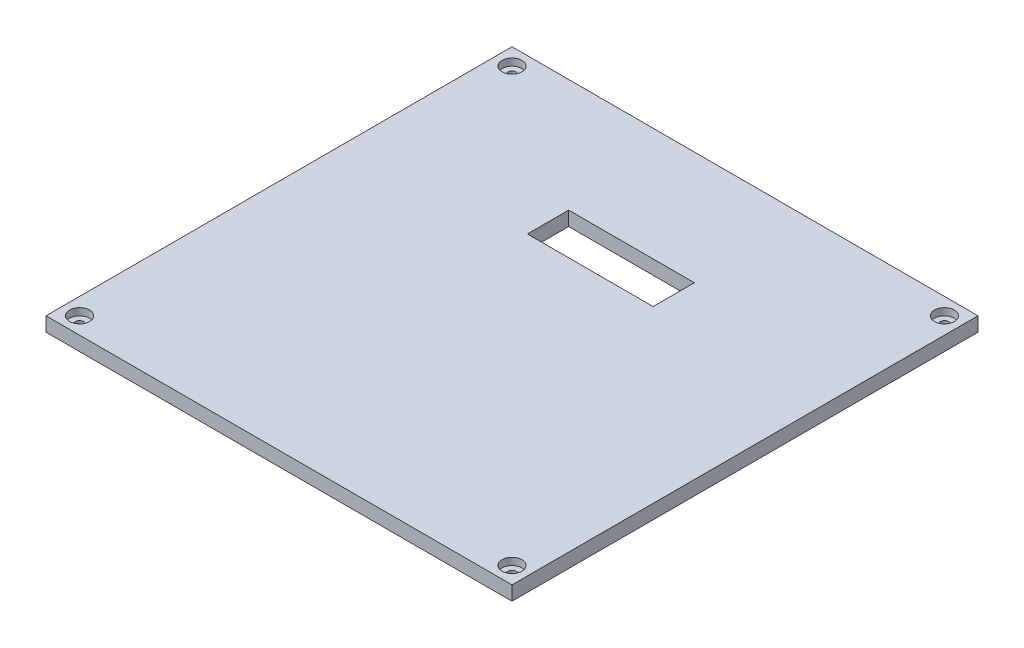
ISO-10303-21;
HEADER;
FILE_DESCRIPTION(('STEP AP214'),'2;1');
FILE_NAME('part.step','',(''),(''),'','','');
FILE_SCHEMA(('AUTOMOTIVE_DESIGN { 1 0 10303 214 1 1 1 1 }'));
ENDSEC;
DATA;
#1=APPLICATION_CONTEXT('core data for automotive mechanical design processes');
#2=APPLICATION_PROTOCOL_DEFINITION('international standard','automotive_design',2000,#1);
#3=PRODUCT_CONTEXT('',#1,'mechanical');
#4=PRODUCT('Part','Part','',(#3));
#5=PRODUCT_RELATED_PRODUCT_CATEGORY('part','',(#4));
#6=PRODUCT_DEFINITION_FORMATION('','',#4);
#7=PRODUCT_DEFINITION_CONTEXT('part definition',#1,'design');
#8=PRODUCT_DEFINITION('design','',#6,#7);
#9=PRODUCT_DEFINITION_SHAPE('','',#8);
#10=(LENGTH_UNIT() NAMED_UNIT(*) SI_UNIT(.MILLI.,.METRE.));
#11=(NAMED_UNIT(*) PLANE_ANGLE_UNIT() SI_UNIT($,.RADIAN.));
#12=(NAMED_UNIT(*) SI_UNIT($,.STERADIAN.) SOLID_ANGLE_UNIT());
#13=UNCERTAINTY_MEASURE_WITH_UNIT(LENGTH_MEASURE(1.E-05),#10,'distance_accuracy_value','');
#14=(GEOMETRIC_REPRESENTATION_CONTEXT(3) GLOBAL_UNCERTAINTY_ASSIGNED_CONTEXT((#13)) GLOBAL_UNIT_ASSIGNED_CONTEXT((#10,
#11,#12)) REPRESENTATION_CONTEXT('',''));
#15=CARTESIAN_POINT('',(0.,0.,0.));
#16=DIRECTION('',(0.,0.,1.));
#17=DIRECTION('',(1.,0.,0.));
#18=AXIS2_PLACEMENT_3D('',#15,#16,#17);
#19=CARTESIAN_POINT('',(401.094,0.,-401.094));
#20=DIRECTION('',(0.,1.,0.));
#21=DIRECTION('',(0.,0.,1.));
#22=AXIS2_PLACEMENT_3D('',#19,#20,#21);
#23=CYLINDRICAL_SURFACE('',#22,3.683);
#24=CARTESIAN_POINT('',(401.094,0.,-401.094));
#25=DIRECTION('',(0.,1.,0.));
#26=DIRECTION('',(0.,0.,-1.));
#27=AXIS2_PLACEMENT_3D('',#24,#25,#26);
#28=CIRCLE('',#27,3.683);
#29=CARTESIAN_POINT('',(401.094,0.,-404.777));
#30=VERTEX_POINT('',#29);
#31=EDGE_CURVE('E152',#30,#30,#28,.T.);
#32=ORIENTED_EDGE('',*,*,#31,.F.);
#33=EDGE_LOOP('',(#32));
#34=FACE_BOUND('',#33,.T.);
#35=CARTESIAN_POINT('',(401.094,6.35,-401.094));
#36=DIRECTION('',(0.,1.,0.));
#37=DIRECTION('',(0.,0.,1.));
#38=AXIS2_PLACEMENT_3D('',#35,#36,#37);
#39=CIRCLE('',#38,3.683);
#40=CARTESIAN_POINT('',(401.094,6.35,-397.411));
#41=VERTEX_POINT('',#40);
#42=EDGE_CURVE('E142',#41,#41,#39,.F.);
#43=ORIENTED_EDGE('',*,*,#42,.F.);
#44=EDGE_LOOP('',(#43));
#45=FACE_BOUND('',#44,.T.);
#46=ADVANCED_FACE('F39',(#34,#45),#23,.F.);
#47=CARTESIAN_POINT('',(14.986,0.,-401.094));
#48=DIRECTION('',(0.,1.,0.));
#49=DIRECTION('',(0.,0.,1.));
#50=AXIS2_PLACEMENT_3D('',#47,#48,#49);
#51=CYLINDRICAL_SURFACE('',#50,3.683);
#52=CARTESIAN_POINT('',(14.986,0.,-401.094));
#53=DIRECTION('',(0.,-1.,0.));
#54=DIRECTION('',(0.,0.,-1.));
#55=AXIS2_PLACEMENT_3D('',#52,#53,#54);
#56=CIRCLE('',#55,3.683);
#57=CARTESIAN_POINT('',(14.986,0.,-404.777));
#58=VERTEX_POINT('',#57);
#59=EDGE_CURVE('E155',#58,#58,#56,.T.);
#60=ORIENTED_EDGE('',*,*,#59,.T.);
#61=EDGE_LOOP('',(#60));
#62=FACE_BOUND('',#61,.T.);
#63=CARTESIAN_POINT('',(14.986,6.35,-401.094));
#64=DIRECTION('',(0.,1.,0.));
#65=DIRECTION('',(0.,0.,1.));
#66=AXIS2_PLACEMENT_3D('',#63,#64,#65);
#67=CIRCLE('',#66,3.683);
#68=CARTESIAN_POINT('',(14.986,6.35,-397.411));
#69=VERTEX_POINT('',#68);
#70=EDGE_CURVE('E146',#69,#69,#67,.T.);
#71=ORIENTED_EDGE('',*,*,#70,.T.);
#72=EDGE_LOOP('',(#71));
#73=FACE_BOUND('',#72,.T.);
#74=ADVANCED_FACE('F258',(#62,#73),#51,.F.);
#75=CARTESIAN_POINT('',(401.094,0.,-14.986));
#76=DIRECTION('',(0.,1.,0.));
#77=DIRECTION('',(0.,0.,1.));
#78=AXIS2_PLACEMENT_3D('',#75,#76,#77);
#79=CYLINDRICAL_SURFACE('',#78,3.683);
#80=CARTESIAN_POINT('',(401.094,0.,-14.986));
#81=DIRECTION('',(0.,-1.,0.));
#82=DIRECTION('',(0.,0.,1.));
#83=AXIS2_PLACEMENT_3D('',#80,#81,#82);
#84=CIRCLE('',#83,3.683);
#85=CARTESIAN_POINT('',(401.094,0.,-11.303));
#86=VERTEX_POINT('',#85);
#87=EDGE_CURVE('E159',#86,#86,#84,.T.);
#88=ORIENTED_EDGE('',*,*,#87,.T.);
#89=EDGE_LOOP('',(#88));
#90=FACE_BOUND('',#89,.T.);
#91=CARTESIAN_POINT('',(401.094,6.35,-14.986));
#92=DIRECTION('',(0.,1.,0.));
#93=DIRECTION('',(0.,0.,1.));
#94=AXIS2_PLACEMENT_3D('',#91,#92,#93);
#95=CIRCLE('',#94,3.683);
#96=CARTESIAN_POINT('',(401.094,6.35,-11.303));
#97=VERTEX_POINT('',#96);
#98=EDGE_CURVE('E150',#97,#97,#95,.T.);
#99=ORIENTED_EDGE('',*,*,#98,.T.);
#100=EDGE_LOOP('',(#99));
#101=FACE_BOUND('',#100,.T.);
#102=ADVANCED_FACE('F265',(#90,#101),#79,.F.);
#103=CARTESIAN_POINT('',(14.986,0.,-14.986));
#104=DIRECTION('',(0.,1.,0.));
#105=DIRECTION('',(0.,0.,1.));
#106=AXIS2_PLACEMENT_3D('',#103,#104,#105);
#107=CYLINDRICAL_SURFACE('',#106,3.683);
#108=CARTESIAN_POINT('',(14.986,0.,-14.986));
#109=DIRECTION('',(0.,1.,0.));
#110=DIRECTION('',(0.,0.,1.));
#111=AXIS2_PLACEMENT_3D('',#108,#109,#110);
#112=CIRCLE('',#111,3.683);
#113=CARTESIAN_POINT('',(14.986,0.,-11.303));
#114=VERTEX_POINT('',#113);
#115=EDGE_CURVE('E166',#114,#114,#112,.T.);
#116=ORIENTED_EDGE('',*,*,#115,.F.);
#117=EDGE_LOOP('',(#116));
#118=FACE_BOUND('',#117,.T.);
#119=CARTESIAN_POINT('',(14.986,6.35,-14.986));
#120=DIRECTION('',(0.,1.,0.));
#121=DIRECTION('',(0.,0.,1.));
#122=AXIS2_PLACEMENT_3D('',#119,#120,#121);
#123=CIRCLE('',#122,3.683);
#124=CARTESIAN_POINT('',(14.986,6.35,-11.303));
#125=VERTEX_POINT('',#124);
#126=EDGE_CURVE('E165',#125,#125,#123,.F.);
#127=ORIENTED_EDGE('',*,*,#126,.F.);
#128=EDGE_LOOP('',(#127));
#129=FACE_BOUND('',#128,.T.);
#130=ADVANCED_FACE('F275',(#118,#129),#107,.F.);
#131=CARTESIAN_POINT('',(0.,12.7,-416.08));
#132=DIRECTION('',(0.,0.,-1.));
#133=DIRECTION('',(-1.,0.,0.));
#134=AXIS2_PLACEMENT_3D('',#131,#132,#133);
#135=PLANE('',#134);
#136=DIRECTION('',(1.,0.,0.));
#137=VECTOR('',#136,1.);
#138=CARTESIAN_POINT('',(0.,0.,-416.08));
#139=LINE('',#138,#137);
#140=CARTESIAN_POINT('',(0.,0.,-416.08));
#141=VERTEX_POINT('',#140);
#142=CARTESIAN_POINT('',(416.08,0.,-416.08));
#143=VERTEX_POINT('',#142);
#144=EDGE_CURVE('E169',#141,#143,#139,.T.);
#145=ORIENTED_EDGE('',*,*,#144,.F.);
#146=DIRECTION('',(0.,-1.,0.));
#147=VECTOR('',#146,1.);
#148=CARTESIAN_POINT('',(0.,12.7,-416.08));
#149=LINE('',#148,#147);
#150=CARTESIAN_POINT('',(0.,12.7,-416.08));
#151=VERTEX_POINT('',#150);
#152=EDGE_CURVE('E11',#151,#141,#149,.T.);
#153=ORIENTED_EDGE('',*,*,#152,.F.);
#154=DIRECTION('',(1.,0.,0.));
#155=VECTOR('',#154,1.);
#156=CARTESIAN_POINT('',(0.,12.7,-416.08));
#157=LINE('',#156,#155);
#158=CARTESIAN_POINT('',(416.08,12.7,-416.08));
#159=VERTEX_POINT('',#158);
#160=EDGE_CURVE('E171',#151,#159,#157,.T.);
#161=ORIENTED_EDGE('',*,*,#160,.T.);
#162=DIRECTION('',(0.,-1.,0.));
#163=VECTOR('',#162,1.);
#164=CARTESIAN_POINT('',(416.08,12.7,-416.08));
#165=LINE('',#164,#163);
#166=EDGE_CURVE('E182',#159,#143,#165,.T.);
#167=ORIENTED_EDGE('',*,*,#166,.T.);
#168=EDGE_LOOP('',(#145,#153,#161,#167));
#169=FACE_BOUND('',#168,.T.);
#170=ADVANCED_FACE('F41',(#169),#135,.T.);
#171=CARTESIAN_POINT('',(0.,12.7,0.));
#172=DIRECTION('',(-1.,0.,0.));
#173=DIRECTION('',(0.,0.,1.));
#174=AXIS2_PLACEMENT_3D('',#171,#172,#173);
#175=PLANE('',#174);
#176=DIRECTION('',(0.,0.,-1.));
#177=VECTOR('',#176,1.);
#178=CARTESIAN_POINT('',(0.,0.,0.));
#179=LINE('',#178,#177);
#180=CARTESIAN_POINT('',(0.,0.,0.));
#181=VERTEX_POINT('',#180);
#182=EDGE_CURVE('E175',#181,#141,#179,.T.);
#183=ORIENTED_EDGE('',*,*,#182,.F.);
#184=DIRECTION('',(0.,-1.,0.));
#185=VECTOR('',#184,1.);
#186=CARTESIAN_POINT('',(0.,12.7,0.));
#187=LINE('',#186,#185);
#188=CARTESIAN_POINT('',(0.,12.7,0.));
#189=VERTEX_POINT('',#188);
#190=EDGE_CURVE('E48',#189,#181,#187,.T.);
#191=ORIENTED_EDGE('',*,*,#190,.F.);
#192=DIRECTION('',(0.,0.,-1.));
#193=VECTOR('',#192,1.);
#194=CARTESIAN_POINT('',(0.,12.7,0.));
#195=LINE('',#194,#193);
#196=EDGE_CURVE('E179',#189,#151,#195,.T.);
#197=ORIENTED_EDGE('',*,*,#196,.T.);
#198=ORIENTED_EDGE('',*,*,#152,.T.);
#199=EDGE_LOOP('',(#183,#191,#197,#198));
#200=FACE_BOUND('',#199,.T.);
#201=ADVANCED_FACE('F234',(#200),#175,.T.);
#202=CARTESIAN_POINT('',(0.,12.7,0.));
#203=DIRECTION('',(0.,0.,-1.));
#204=DIRECTION('',(-1.,0.,0.));
#205=AXIS2_PLACEMENT_3D('',#202,#203,#204);
#206=PLANE('',#205);
#207=DIRECTION('',(1.,0.,0.));
#208=VECTOR('',#207,1.);
#209=CARTESIAN_POINT('',(0.,0.,0.));
#210=LINE('',#209,#208);
#211=CARTESIAN_POINT('',(416.08,0.,0.));
#212=VERTEX_POINT('',#211);
#213=EDGE_CURVE('E188',#181,#212,#210,.T.);
#214=ORIENTED_EDGE('',*,*,#213,.T.);
#215=DIRECTION('',(0.,-1.,0.));
#216=VECTOR('',#215,1.);
#217=CARTESIAN_POINT('',(416.08,12.7,0.));
#218=LINE('',#217,#216);
#219=CARTESIAN_POINT('',(416.08,12.7,0.));
#220=VERTEX_POINT('',#219);
#221=EDGE_CURVE('E193',#220,#212,#218,.T.);
#222=ORIENTED_EDGE('',*,*,#221,.F.);
#223=DIRECTION('',(1.,0.,0.));
#224=VECTOR('',#223,1.);
#225=CARTESIAN_POINT('',(0.,12.7,0.));
#226=LINE('',#225,#224);
#227=EDGE_CURVE('E177',#189,#220,#226,.T.);
#228=ORIENTED_EDGE('',*,*,#227,.F.);
#229=ORIENTED_EDGE('',*,*,#190,.T.);
#230=EDGE_LOOP('',(#214,#222,#228,#229));
#231=FACE_BOUND('',#230,.T.);
#232=ADVANCED_FACE('F240',(#231),#206,.F.);
#233=CARTESIAN_POINT('',(416.08,12.7,0.));
#234=DIRECTION('',(-1.,0.,0.));
#235=DIRECTION('',(0.,0.,1.));
#236=AXIS2_PLACEMENT_3D('',#233,#234,#235);
#237=PLANE('',#236);
#238=DIRECTION('',(0.,0.,-1.));
#239=VECTOR('',#238,1.);
#240=CARTESIAN_POINT('',(416.08,0.,0.));
#241=LINE('',#240,#239);
#242=EDGE_CURVE('E185',#212,#143,#241,.T.);
#243=ORIENTED_EDGE('',*,*,#242,.T.);
#244=ORIENTED_EDGE('',*,*,#166,.F.);
#245=DIRECTION('',(0.,0.,-1.));
#246=VECTOR('',#245,1.);
#247=CARTESIAN_POINT('',(416.08,12.7,0.));
#248=LINE('',#247,#246);
#249=EDGE_CURVE('E174',#220,#159,#248,.T.);
#250=ORIENTED_EDGE('',*,*,#249,.F.);
#251=ORIENTED_EDGE('',*,*,#221,.T.);
#252=EDGE_LOOP('',(#243,#244,#250,#251));
#253=FACE_BOUND('',#252,.T.);
#254=ADVANCED_FACE('F219',(#253),#237,.F.);
#255=CARTESIAN_POINT('',(0.,12.7,0.));
#256=DIRECTION('',(0.,1.,0.));
#257=DIRECTION('',(0.,0.,1.));
#258=AXIS2_PLACEMENT_3D('',#255,#256,#257);
#259=PLANE('',#258);
#260=DIRECTION('',(0.,0.,-1.));
#261=VECTOR('',#260,1.);
#262=CARTESIAN_POINT('',(151.636611101019,12.7,-278.187347613511));
#263=LINE('',#262,#261);
#264=CARTESIAN_POINT('',(151.636611101019,12.7,-278.187347613511));
#265=VERTEX_POINT('',#264);
#266=CARTESIAN_POINT('',(151.636611101019,12.7,-315.030790550331));
#267=VERTEX_POINT('',#266);
#268=EDGE_CURVE('E115',#265,#267,#263,.T.);
#269=ORIENTED_EDGE('',*,*,#268,.T.);
#270=DIRECTION('',(1.,0.,0.));
#271=VECTOR('',#270,1.);
#272=CARTESIAN_POINT('',(151.636611101019,12.7,-315.030790550331));
#273=LINE('',#272,#271);
#274=CARTESIAN_POINT('',(263.880588420168,12.7,-315.030790550331));
#275=VERTEX_POINT('',#274);
#276=EDGE_CURVE('E104',#267,#275,#273,.T.);
#277=ORIENTED_EDGE('',*,*,#276,.T.);
#278=DIRECTION('',(0.,0.,1.));
#279=VECTOR('',#278,1.);
#280=CARTESIAN_POINT('',(263.880588420168,12.7,-278.187347613511));
#281=LINE('',#280,#279);
#282=CARTESIAN_POINT('',(263.880588420168,12.7,-278.187347613511));
#283=VERTEX_POINT('',#282);
#284=EDGE_CURVE('E126',#275,#283,#281,.T.);
#285=ORIENTED_EDGE('',*,*,#284,.T.);
#286=DIRECTION('',(-1.,0.,0.));
#287=VECTOR('',#286,1.);
#288=CARTESIAN_POINT('',(151.636611101019,12.7,-278.187347613511));
#289=LINE('',#288,#287);
#290=EDGE_CURVE('E122',#283,#265,#289,.T.);
#291=ORIENTED_EDGE('',*,*,#290,.T.);
#292=EDGE_LOOP('',(#269,#277,#285,#291));
#293=FACE_BOUND('',#292,.T.);
#294=CARTESIAN_POINT('',(401.094,12.7,-401.094));
#295=DIRECTION('',(0.,1.,0.));
#296=DIRECTION('',(0.,0.,1.));
#297=AXIS2_PLACEMENT_3D('',#294,#295,#296);
#298=CIRCLE('',#297,8.89);
#299=CARTESIAN_POINT('',(401.094,12.7,-392.204));
#300=VERTEX_POINT('',#299);
#301=EDGE_CURVE('E43',#300,#300,#298,.T.);
#302=ORIENTED_EDGE('',*,*,#301,.F.);
#303=EDGE_LOOP('',(#302));
#304=FACE_BOUND('',#303,.T.);
#305=CARTESIAN_POINT('',(14.986,12.7,-401.094));
#306=DIRECTION('',(0.,1.,0.));
#307=DIRECTION('',(0.,0.,1.));
#308=AXIS2_PLACEMENT_3D('',#305,#306,#307);
#309=CIRCLE('',#308,8.89);
#310=CARTESIAN_POINT('',(14.986,12.7,-392.204));
#311=VERTEX_POINT('',#310);
#312=EDGE_CURVE('E151',#311,#311,#309,.F.);
#313=ORIENTED_EDGE('',*,*,#312,.T.);
#314=EDGE_LOOP('',(#313));
#315=FACE_BOUND('',#314,.T.);
#316=CARTESIAN_POINT('',(401.094,12.7,-14.986));
#317=DIRECTION('',(0.,1.,0.));
#318=DIRECTION('',(0.,0.,1.));
#319=AXIS2_PLACEMENT_3D('',#316,#317,#318);
#320=CIRCLE('',#319,8.89);
#321=CARTESIAN_POINT('',(401.094,12.7,-6.096));
#322=VERTEX_POINT('',#321);
#323=EDGE_CURVE('E156',#322,#322,#320,.F.);
#324=ORIENTED_EDGE('',*,*,#323,.T.);
#325=EDGE_LOOP('',(#324));
#326=FACE_BOUND('',#325,.T.);
#327=CARTESIAN_POINT('',(14.986,12.7,-14.986));
#328=DIRECTION('',(0.,1.,0.));
#329=DIRECTION('',(0.,0.,1.));
#330=AXIS2_PLACEMENT_3D('',#327,#328,#329);
#331=CIRCLE('',#330,8.89);
#332=CARTESIAN_POINT('',(14.986,12.7,-6.096));
#333=VERTEX_POINT('',#332);
#334=EDGE_CURVE('E170',#333,#333,#331,.T.);
#335=ORIENTED_EDGE('',*,*,#334,.F.);
#336=EDGE_LOOP('',(#335));
#337=FACE_BOUND('',#336,.T.);
#338=ORIENTED_EDGE('',*,*,#160,.F.);
#339=ORIENTED_EDGE('',*,*,#196,.F.);
#340=ORIENTED_EDGE('',*,*,#227,.T.);
#341=ORIENTED_EDGE('',*,*,#249,.T.);
#342=EDGE_LOOP('',(#338,#339,#340,#341));
#343=FACE_BOUND('',#342,.T.);
#344=ADVANCED_FACE('F120',(#293,#304,#315,#326,#337,#343),#259,.T.);
#345=CARTESIAN_POINT('',(0.,0.,0.));
#346=DIRECTION('',(0.,1.,0.));
#347=DIRECTION('',(0.,0.,1.));
#348=AXIS2_PLACEMENT_3D('',#345,#346,#347);
#349=PLANE('',#348);
#350=DIRECTION('',(1.,0.,0.));
#351=VECTOR('',#350,1.);
#352=CARTESIAN_POINT('',(151.636611101019,0.,-315.030790550331));
#353=LINE('',#352,#351);
#354=CARTESIAN_POINT('',(151.636611101019,0.,-315.030790550331));
#355=VERTEX_POINT('',#354);
#356=CARTESIAN_POINT('',(263.880588420168,0.,-315.030790550331));
#357=VERTEX_POINT('',#356);
#358=EDGE_CURVE('E124',#355,#357,#353,.T.);
#359=ORIENTED_EDGE('',*,*,#358,.F.);
#360=DIRECTION('',(0.,0.,-1.));
#361=VECTOR('',#360,1.);
#362=CARTESIAN_POINT('',(151.636611101019,0.,-278.187347613511));
#363=LINE('',#362,#361);
#364=CARTESIAN_POINT('',(151.636611101019,0.,-278.187347613511));
#365=VERTEX_POINT('',#364);
#366=EDGE_CURVE('E64',#365,#355,#363,.T.);
#367=ORIENTED_EDGE('',*,*,#366,.F.);
#368=DIRECTION('',(-1.,0.,0.));
#369=VECTOR('',#368,1.);
#370=CARTESIAN_POINT('',(151.636611101019,0.,-278.187347613511));
#371=LINE('',#370,#369);
#372=CARTESIAN_POINT('',(263.880588420168,0.,-278.187347613511));
#373=VERTEX_POINT('',#372);
#374=EDGE_CURVE('E117',#373,#365,#371,.T.);
#375=ORIENTED_EDGE('',*,*,#374,.F.);
#376=DIRECTION('',(0.,0.,1.));
#377=VECTOR('',#376,1.);
#378=CARTESIAN_POINT('',(263.880588420168,0.,-278.187347613511));
#379=LINE('',#378,#377);
#380=EDGE_CURVE('E131',#357,#373,#379,.T.);
#381=ORIENTED_EDGE('',*,*,#380,.F.);
#382=EDGE_LOOP('',(#359,#367,#375,#381));
#383=FACE_BOUND('',#382,.T.);
#384=ORIENTED_EDGE('',*,*,#31,.T.);
#385=EDGE_LOOP('',(#384));
#386=FACE_BOUND('',#385,.T.);
#387=ORIENTED_EDGE('',*,*,#59,.F.);
#388=EDGE_LOOP('',(#387));
#389=FACE_BOUND('',#388,.T.);
#390=ORIENTED_EDGE('',*,*,#87,.F.);
#391=EDGE_LOOP('',(#390));
#392=FACE_BOUND('',#391,.T.);
#393=ORIENTED_EDGE('',*,*,#115,.T.);
#394=EDGE_LOOP('',(#393));
#395=FACE_BOUND('',#394,.T.);
#396=ORIENTED_EDGE('',*,*,#144,.T.);
#397=ORIENTED_EDGE('',*,*,#242,.F.);
#398=ORIENTED_EDGE('',*,*,#213,.F.);
#399=ORIENTED_EDGE('',*,*,#182,.T.);
#400=EDGE_LOOP('',(#396,#397,#398,#399));
#401=FACE_BOUND('',#400,.T.);
#402=ADVANCED_FACE('F218',(#383,#386,#389,#392,#395,#401),#349,.F.);
#403=CARTESIAN_POINT('',(14.986,6.35,-14.986));
#404=DIRECTION('',(0.,1.,0.));
#405=DIRECTION('',(0.,0.,1.));
#406=AXIS2_PLACEMENT_3D('',#403,#404,#405);
#407=PLANE('',#406);
#408=CARTESIAN_POINT('',(14.986,6.35,-14.986));
#409=DIRECTION('',(0.,1.,0.));
#410=DIRECTION('',(0.,0.,1.));
#411=AXIS2_PLACEMENT_3D('',#408,#409,#410);
#412=CIRCLE('',#411,8.89);
#413=CARTESIAN_POINT('',(14.986,6.35,-6.096));
#414=VERTEX_POINT('',#413);
#415=EDGE_CURVE('E162',#414,#414,#412,.T.);
#416=ORIENTED_EDGE('',*,*,#415,.T.);
#417=EDGE_LOOP('',(#416));
#418=FACE_BOUND('',#417,.T.);
#419=ORIENTED_EDGE('',*,*,#126,.T.);
#420=EDGE_LOOP('',(#419));
#421=FACE_BOUND('',#420,.T.);
#422=ADVANCED_FACE('F245',(#418,#421),#407,.T.);
#423=CARTESIAN_POINT('',(14.986,6.35,-14.986));
#424=DIRECTION('',(0.,1.,0.));
#425=DIRECTION('',(0.,0.,1.));
#426=AXIS2_PLACEMENT_3D('',#423,#424,#425);
#427=CYLINDRICAL_SURFACE('',#426,8.89);
#428=ORIENTED_EDGE('',*,*,#334,.T.);
#429=EDGE_LOOP('',(#428));
#430=FACE_BOUND('',#429,.T.);
#431=ORIENTED_EDGE('',*,*,#415,.F.);
#432=EDGE_LOOP('',(#431));
#433=FACE_BOUND('',#432,.T.);
#434=ADVANCED_FACE('F252',(#430,#433),#427,.F.);
#435=CARTESIAN_POINT('',(401.094,6.35,-14.986));
#436=DIRECTION('',(0.,1.,0.));
#437=DIRECTION('',(0.,0.,1.));
#438=AXIS2_PLACEMENT_3D('',#435,#436,#437);
#439=CYLINDRICAL_SURFACE('',#438,8.89);
#440=ORIENTED_EDGE('',*,*,#323,.F.);
#441=EDGE_LOOP('',(#440));
#442=FACE_BOUND('',#441,.T.);
#443=CARTESIAN_POINT('',(401.094,6.35,-14.986));
#444=DIRECTION('',(0.,-1.,0.));
#445=DIRECTION('',(0.,0.,1.));
#446=AXIS2_PLACEMENT_3D('',#443,#444,#445);
#447=CIRCLE('',#446,8.89);
#448=CARTESIAN_POINT('',(401.094,6.35,-6.096));
#449=VERTEX_POINT('',#448);
#450=EDGE_CURVE('E147',#449,#449,#447,.T.);
#451=ORIENTED_EDGE('',*,*,#450,.T.);
#452=EDGE_LOOP('',(#451));
#453=FACE_BOUND('',#452,.T.);
#454=ADVANCED_FACE('F271',(#442,#453),#439,.F.);
#455=CARTESIAN_POINT('',(401.094,6.35,-14.986));
#456=DIRECTION('',(0.,1.,0.));
#457=DIRECTION('',(0.,0.,1.));
#458=AXIS2_PLACEMENT_3D('',#455,#456,#457);
#459=PLANE('',#458);
#460=ORIENTED_EDGE('',*,*,#98,.F.);
#461=EDGE_LOOP('',(#460));
#462=FACE_BOUND('',#461,.T.);
#463=ORIENTED_EDGE('',*,*,#450,.F.);
#464=EDGE_LOOP('',(#463));
#465=FACE_BOUND('',#464,.T.);
#466=ADVANCED_FACE('F362',(#462,#465),#459,.T.);
#467=CARTESIAN_POINT('',(14.986,6.35,-401.094));
#468=DIRECTION('',(0.,1.,0.));
#469=DIRECTION('',(0.,0.,1.));
#470=AXIS2_PLACEMENT_3D('',#467,#468,#469);
#471=CYLINDRICAL_SURFACE('',#470,8.89);
#472=ORIENTED_EDGE('',*,*,#312,.F.);
#473=EDGE_LOOP('',(#472));
#474=FACE_BOUND('',#473,.T.);
#475=CARTESIAN_POINT('',(14.986,6.35,-401.094));
#476=DIRECTION('',(0.,-1.,0.));
#477=DIRECTION('',(0.,0.,-1.));
#478=AXIS2_PLACEMENT_3D('',#475,#476,#477);
#479=CIRCLE('',#478,8.89);
#480=CARTESIAN_POINT('',(14.986,6.35,-409.984));
#481=VERTEX_POINT('',#480);
#482=EDGE_CURVE('E143',#481,#481,#479,.T.);
#483=ORIENTED_EDGE('',*,*,#482,.T.);
#484=EDGE_LOOP('',(#483));
#485=FACE_BOUND('',#484,.T.);
#486=ADVANCED_FACE('F370',(#474,#485),#471,.F.);
#487=CARTESIAN_POINT('',(14.986,6.35,-401.094));
#488=DIRECTION('',(0.,1.,0.));
#489=DIRECTION('',(0.,0.,-1.));
#490=AXIS2_PLACEMENT_3D('',#487,#488,#489);
#491=PLANE('',#490);
#492=ORIENTED_EDGE('',*,*,#70,.F.);
#493=EDGE_LOOP('',(#492));
#494=FACE_BOUND('',#493,.T.);
#495=ORIENTED_EDGE('',*,*,#482,.F.);
#496=EDGE_LOOP('',(#495));
#497=FACE_BOUND('',#496,.T.);
#498=ADVANCED_FACE('F378',(#494,#497),#491,.T.);
#499=CARTESIAN_POINT('',(401.094,6.35,-401.094));
#500=DIRECTION('',(0.,1.,0.));
#501=DIRECTION('',(0.,0.,-1.));
#502=AXIS2_PLACEMENT_3D('',#499,#500,#501);
#503=PLANE('',#502);
#504=CARTESIAN_POINT('',(401.094,6.35,-401.094));
#505=DIRECTION('',(0.,1.,0.));
#506=DIRECTION('',(0.,0.,-1.));
#507=AXIS2_PLACEMENT_3D('',#504,#505,#506);
#508=CIRCLE('',#507,8.89);
#509=CARTESIAN_POINT('',(401.094,6.35,-409.984));
#510=VERTEX_POINT('',#509);
#511=EDGE_CURVE('E111',#510,#510,#508,.T.);
#512=ORIENTED_EDGE('',*,*,#511,.T.);
#513=EDGE_LOOP('',(#512));
#514=FACE_BOUND('',#513,.T.);
#515=ORIENTED_EDGE('',*,*,#42,.T.);
#516=EDGE_LOOP('',(#515));
#517=FACE_BOUND('',#516,.T.);
#518=ADVANCED_FACE('F387',(#514,#517),#503,.T.);
#519=CARTESIAN_POINT('',(401.094,6.35,-401.094));
#520=DIRECTION('',(0.,1.,0.));
#521=DIRECTION('',(0.,0.,1.));
#522=AXIS2_PLACEMENT_3D('',#519,#520,#521);
#523=CYLINDRICAL_SURFACE('',#522,8.89);
#524=ORIENTED_EDGE('',*,*,#301,.T.);
#525=EDGE_LOOP('',(#524));
#526=FACE_BOUND('',#525,.T.);
#527=ORIENTED_EDGE('',*,*,#511,.F.);
#528=EDGE_LOOP('',(#527));
#529=FACE_BOUND('',#528,.T.);
#530=ADVANCED_FACE('F214',(#526,#529),#523,.F.);
#531=CARTESIAN_POINT('',(151.636611101019,12.701,-278.187347613511));
#532=DIRECTION('',(-1.,0.,0.));
#533=DIRECTION('',(0.,0.,1.));
#534=AXIS2_PLACEMENT_3D('',#531,#532,#533);
#535=PLANE('',#534);
#536=DIRECTION('',(0.,-1.,0.));
#537=VECTOR('',#536,1.);
#538=CARTESIAN_POINT('',(151.636611101019,12.701,-278.187347613511));
#539=LINE('',#538,#537);
#540=EDGE_CURVE('E112',#265,#365,#539,.T.);
#541=ORIENTED_EDGE('',*,*,#540,.T.);
#542=ORIENTED_EDGE('',*,*,#366,.T.);
#543=DIRECTION('',(0.,-1.,0.));
#544=VECTOR('',#543,1.);
#545=CARTESIAN_POINT('',(151.636611101019,12.701,-315.030790550331));
#546=LINE('',#545,#544);
#547=EDGE_CURVE('E106',#267,#355,#546,.T.);
#548=ORIENTED_EDGE('',*,*,#547,.F.);
#549=ORIENTED_EDGE('',*,*,#268,.F.);
#550=EDGE_LOOP('',(#541,#542,#548,#549));
#551=FACE_BOUND('',#550,.T.);
#552=ADVANCED_FACE('F114',(#551),#535,.F.);
#553=CARTESIAN_POINT('',(151.636611101019,12.701,-278.187347613511));
#554=DIRECTION('',(0.,0.,1.));
#555=DIRECTION('',(1.,0.,0.));
#556=AXIS2_PLACEMENT_3D('',#553,#554,#555);
#557=PLANE('',#556);
#558=DIRECTION('',(0.,-1.,0.));
#559=VECTOR('',#558,1.);
#560=CARTESIAN_POINT('',(263.880588420168,12.701,-278.187347613511));
#561=LINE('',#560,#559);
#562=EDGE_CURVE('E137',#283,#373,#561,.T.);
#563=ORIENTED_EDGE('',*,*,#562,.T.);
#564=ORIENTED_EDGE('',*,*,#374,.T.);
#565=ORIENTED_EDGE('',*,*,#540,.F.);
#566=ORIENTED_EDGE('',*,*,#290,.F.);
#567=EDGE_LOOP('',(#563,#564,#565,#566));
#568=FACE_BOUND('',#567,.T.);
#569=ADVANCED_FACE('F410',(#568),#557,.F.);
#570=CARTESIAN_POINT('',(263.880588420168,12.701,-278.187347613511));
#571=DIRECTION('',(1.,0.,0.));
#572=DIRECTION('',(0.,0.,-1.));
#573=AXIS2_PLACEMENT_3D('',#570,#571,#572);
#574=PLANE('',#573);
#575=DIRECTION('',(0.,-1.,0.));
#576=VECTOR('',#575,1.);
#577=CARTESIAN_POINT('',(263.880588420168,12.701,-315.030790550331));
#578=LINE('',#577,#576);
#579=EDGE_CURVE('E56',#275,#357,#578,.T.);
#580=ORIENTED_EDGE('',*,*,#579,.T.);
#581=ORIENTED_EDGE('',*,*,#380,.T.);
#582=ORIENTED_EDGE('',*,*,#562,.F.);
#583=ORIENTED_EDGE('',*,*,#284,.F.);
#584=EDGE_LOOP('',(#580,#581,#582,#583));
#585=FACE_BOUND('',#584,.T.);
#586=ADVANCED_FACE('F418',(#585),#574,.F.);
#587=CARTESIAN_POINT('',(151.636611101019,12.701,-315.030790550331));
#588=DIRECTION('',(0.,0.,-1.));
#589=DIRECTION('',(-1.,0.,0.));
#590=AXIS2_PLACEMENT_3D('',#587,#588,#589);
#591=PLANE('',#590);
#592=ORIENTED_EDGE('',*,*,#547,.T.);
#593=ORIENTED_EDGE('',*,*,#358,.T.);
#594=ORIENTED_EDGE('',*,*,#579,.F.);
#595=ORIENTED_EDGE('',*,*,#276,.F.);
#596=EDGE_LOOP('',(#592,#593,#594,#595));
#597=FACE_BOUND('',#596,.T.);
#598=ADVANCED_FACE('F105',(#597),#591,.F.);
#599=CLOSED_SHELL('',(#46,#74,#102,#130,#170,#201,#232,#254,#344,#402,#422,#434,#454,#466,#486,
#498,#518,#530,#552,#569,#586,#598));
#600=MANIFOLD_SOLID_BREP('B2',#599);
#601=ADVANCED_BREP_SHAPE_REPRESENTATION('',(#18,#600),#14);
#602=SHAPE_DEFINITION_REPRESENTATION(#9,#601);
ENDSEC;
END-ISO-10303-21;
